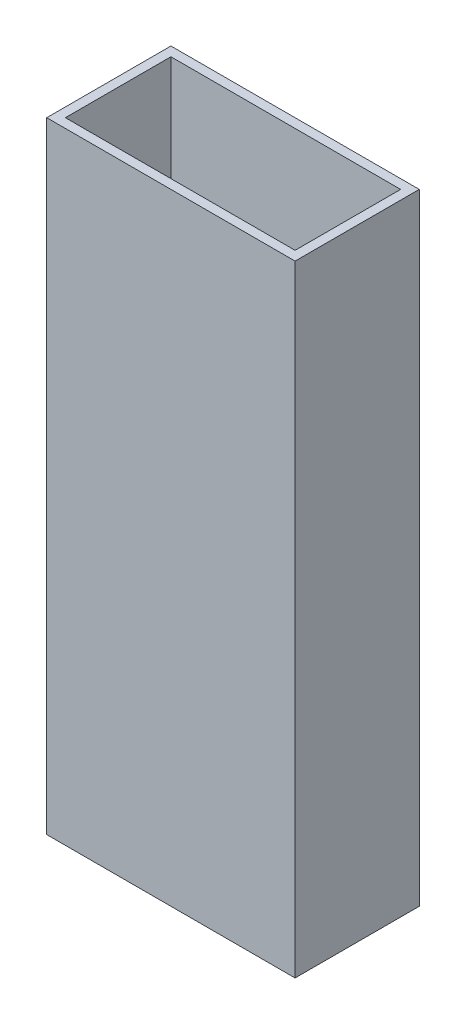
ISO-10303-21;
HEADER;
FILE_DESCRIPTION(('STEP AP214'),'2;1');
FILE_NAME('part.step','',(''),(''),'','','');
FILE_SCHEMA(('AUTOMOTIVE_DESIGN { 1 0 10303 214 1 1 1 1 }'));
ENDSEC;
DATA;
#1=APPLICATION_CONTEXT('core data for automotive mechanical design processes');
#2=APPLICATION_PROTOCOL_DEFINITION('international standard','automotive_design',2000,#1);
#3=PRODUCT_CONTEXT('',#1,'mechanical');
#4=PRODUCT('Part','Part','',(#3));
#5=PRODUCT_RELATED_PRODUCT_CATEGORY('part','',(#4));
#6=PRODUCT_DEFINITION_FORMATION('','',#4);
#7=PRODUCT_DEFINITION_CONTEXT('part definition',#1,'design');
#8=PRODUCT_DEFINITION('design','',#6,#7);
#9=PRODUCT_DEFINITION_SHAPE('','',#8);
#10=(LENGTH_UNIT() NAMED_UNIT(*) SI_UNIT(.MILLI.,.METRE.));
#11=(NAMED_UNIT(*) PLANE_ANGLE_UNIT() SI_UNIT($,.RADIAN.));
#12=(NAMED_UNIT(*) SI_UNIT($,.STERADIAN.) SOLID_ANGLE_UNIT());
#13=UNCERTAINTY_MEASURE_WITH_UNIT(LENGTH_MEASURE(1.E-05),#10,'distance_accuracy_value','');
#14=(GEOMETRIC_REPRESENTATION_CONTEXT(3) GLOBAL_UNCERTAINTY_ASSIGNED_CONTEXT((#13)) GLOBAL_UNIT_ASSIGNED_CONTEXT((#10,
#11,#12)) REPRESENTATION_CONTEXT('',''));
#15=CARTESIAN_POINT('',(0.,0.,0.));
#16=DIRECTION('',(0.,0.,1.));
#17=DIRECTION('',(1.,0.,0.));
#18=AXIS2_PLACEMENT_3D('',#15,#16,#17);
#19=CARTESIAN_POINT('',(0.,100.,0.));
#20=DIRECTION('',(0.,-1.,0.));
#21=DIRECTION('',(0.,0.,-1.));
#22=AXIS2_PLACEMENT_3D('',#19,#20,#21);
#23=PLANE('',#22);
#24=DIRECTION('',(0.,0.,-1.));
#25=VECTOR('',#24,1.);
#26=CARTESIAN_POINT('',(20.,100.,10.));
#27=LINE('',#26,#25);
#28=CARTESIAN_POINT('',(20.,100.,10.));
#29=VERTEX_POINT('',#28);
#30=CARTESIAN_POINT('',(20.,100.,-10.));
#31=VERTEX_POINT('',#30);
#32=EDGE_CURVE('E134',#29,#31,#27,.T.);
#33=ORIENTED_EDGE('',*,*,#32,.T.);
#34=DIRECTION('',(-1.,0.,0.));
#35=VECTOR('',#34,1.);
#36=CARTESIAN_POINT('',(-20.,100.,-10.));
#37=LINE('',#36,#35);
#38=CARTESIAN_POINT('',(-20.,100.,-10.));
#39=VERTEX_POINT('',#38);
#40=EDGE_CURVE('E137',#31,#39,#37,.T.);
#41=ORIENTED_EDGE('',*,*,#40,.T.);
#42=DIRECTION('',(0.,0.,1.));
#43=VECTOR('',#42,1.);
#44=CARTESIAN_POINT('',(-20.,100.,10.));
#45=LINE('',#44,#43);
#46=CARTESIAN_POINT('',(-20.,100.,10.));
#47=VERTEX_POINT('',#46);
#48=EDGE_CURVE('E140',#39,#47,#45,.T.);
#49=ORIENTED_EDGE('',*,*,#48,.T.);
#50=DIRECTION('',(1.,0.,0.));
#51=VECTOR('',#50,1.);
#52=CARTESIAN_POINT('',(-20.,100.,10.));
#53=LINE('',#52,#51);
#54=EDGE_CURVE('E142',#47,#29,#53,.T.);
#55=ORIENTED_EDGE('',*,*,#54,.T.);
#56=EDGE_LOOP('',(#33,#41,#49,#55));
#57=FACE_BOUND('',#56,.T.);
#58=DIRECTION('',(0.,0.,1.));
#59=VECTOR('',#58,1.);
#60=CARTESIAN_POINT('',(-18.5,100.,8.5));
#61=LINE('',#60,#59);
#62=CARTESIAN_POINT('',(-18.5,100.,-8.5));
#63=VERTEX_POINT('',#62);
#64=CARTESIAN_POINT('',(-18.5,100.,8.5));
#65=VERTEX_POINT('',#64);
#66=EDGE_CURVE('E98',#63,#65,#61,.T.);
#67=ORIENTED_EDGE('',*,*,#66,.F.);
#68=DIRECTION('',(-1.,0.,0.));
#69=VECTOR('',#68,1.);
#70=CARTESIAN_POINT('',(18.5,100.,-8.5));
#71=LINE('',#70,#69);
#72=CARTESIAN_POINT('',(18.5,100.,-8.5));
#73=VERTEX_POINT('',#72);
#74=EDGE_CURVE('E120',#73,#63,#71,.T.);
#75=ORIENTED_EDGE('',*,*,#74,.F.);
#76=DIRECTION('',(0.,0.,-1.));
#77=VECTOR('',#76,1.);
#78=CARTESIAN_POINT('',(18.5,100.,8.5));
#79=LINE('',#78,#77);
#80=CARTESIAN_POINT('',(18.5,100.,8.5));
#81=VERTEX_POINT('',#80);
#82=EDGE_CURVE('E118',#81,#73,#79,.T.);
#83=ORIENTED_EDGE('',*,*,#82,.F.);
#84=DIRECTION('',(1.,0.,0.));
#85=VECTOR('',#84,1.);
#86=CARTESIAN_POINT('',(18.5,100.,8.5));
#87=LINE('',#86,#85);
#88=EDGE_CURVE('E106',#65,#81,#87,.T.);
#89=ORIENTED_EDGE('',*,*,#88,.F.);
#90=EDGE_LOOP('',(#67,#75,#83,#89));
#91=FACE_BOUND('',#90,.T.);
#92=ADVANCED_FACE('F33',(#57,#91),#23,.F.);
#93=CARTESIAN_POINT('',(0.,0.,0.));
#94=DIRECTION('',(0.,-1.,0.));
#95=DIRECTION('',(0.,0.,-1.));
#96=AXIS2_PLACEMENT_3D('',#93,#94,#95);
#97=PLANE('',#96);
#98=DIRECTION('',(0.,0.,-1.));
#99=VECTOR('',#98,1.);
#100=CARTESIAN_POINT('',(20.,0.,10.));
#101=LINE('',#100,#99);
#102=CARTESIAN_POINT('',(20.,0.,10.));
#103=VERTEX_POINT('',#102);
#104=CARTESIAN_POINT('',(20.,0.,-10.));
#105=VERTEX_POINT('',#104);
#106=EDGE_CURVE('E114',#103,#105,#101,.T.);
#107=ORIENTED_EDGE('',*,*,#106,.F.);
#108=DIRECTION('',(1.,0.,0.));
#109=VECTOR('',#108,1.);
#110=CARTESIAN_POINT('',(-20.,0.,10.));
#111=LINE('',#110,#109);
#112=CARTESIAN_POINT('',(-20.,0.,10.));
#113=VERTEX_POINT('',#112);
#114=EDGE_CURVE('E138',#113,#103,#111,.T.);
#115=ORIENTED_EDGE('',*,*,#114,.F.);
#116=DIRECTION('',(0.,0.,1.));
#117=VECTOR('',#116,1.);
#118=CARTESIAN_POINT('',(-20.,0.,10.));
#119=LINE('',#118,#117);
#120=CARTESIAN_POINT('',(-20.,0.,-10.));
#121=VERTEX_POINT('',#120);
#122=EDGE_CURVE('E149',#121,#113,#119,.T.);
#123=ORIENTED_EDGE('',*,*,#122,.F.);
#124=DIRECTION('',(-1.,0.,0.));
#125=VECTOR('',#124,1.);
#126=CARTESIAN_POINT('',(-20.,0.,-10.));
#127=LINE('',#126,#125);
#128=EDGE_CURVE('E147',#105,#121,#127,.T.);
#129=ORIENTED_EDGE('',*,*,#128,.F.);
#130=EDGE_LOOP('',(#107,#115,#123,#129));
#131=FACE_BOUND('',#130,.T.);
#132=DIRECTION('',(-1.,0.,0.));
#133=VECTOR('',#132,1.);
#134=CARTESIAN_POINT('',(18.5,0.,-8.5));
#135=LINE('',#134,#133);
#136=CARTESIAN_POINT('',(18.5,0.,-8.5));
#137=VERTEX_POINT('',#136);
#138=CARTESIAN_POINT('',(-18.5,0.,-8.5));
#139=VERTEX_POINT('',#138);
#140=EDGE_CURVE('E107',#137,#139,#135,.T.);
#141=ORIENTED_EDGE('',*,*,#140,.T.);
#142=DIRECTION('',(0.,0.,1.));
#143=VECTOR('',#142,1.);
#144=CARTESIAN_POINT('',(-18.5,0.,8.5));
#145=LINE('',#144,#143);
#146=CARTESIAN_POINT('',(-18.5,0.,8.5));
#147=VERTEX_POINT('',#146);
#148=EDGE_CURVE('E56',#139,#147,#145,.T.);
#149=ORIENTED_EDGE('',*,*,#148,.T.);
#150=DIRECTION('',(1.,0.,0.));
#151=VECTOR('',#150,1.);
#152=CARTESIAN_POINT('',(18.5,0.,8.5));
#153=LINE('',#152,#151);
#154=CARTESIAN_POINT('',(18.5,0.,8.5));
#155=VERTEX_POINT('',#154);
#156=EDGE_CURVE('E113',#147,#155,#153,.T.);
#157=ORIENTED_EDGE('',*,*,#156,.T.);
#158=DIRECTION('',(0.,0.,-1.));
#159=VECTOR('',#158,1.);
#160=CARTESIAN_POINT('',(18.5,0.,8.5));
#161=LINE('',#160,#159);
#162=EDGE_CURVE('E126',#155,#137,#161,.T.);
#163=ORIENTED_EDGE('',*,*,#162,.T.);
#164=EDGE_LOOP('',(#141,#149,#157,#163));
#165=FACE_BOUND('',#164,.T.);
#166=ADVANCED_FACE('F167',(#131,#165),#97,.T.);
#167=CARTESIAN_POINT('',(20.,100.,10.));
#168=DIRECTION('',(-1.,0.,0.));
#169=DIRECTION('',(0.,0.,1.));
#170=AXIS2_PLACEMENT_3D('',#167,#168,#169);
#171=PLANE('',#170);
#172=ORIENTED_EDGE('',*,*,#106,.T.);
#173=DIRECTION('',(0.,-1.,0.));
#174=VECTOR('',#173,1.);
#175=CARTESIAN_POINT('',(20.,100.,-10.));
#176=LINE('',#175,#174);
#177=EDGE_CURVE('E11',#31,#105,#176,.T.);
#178=ORIENTED_EDGE('',*,*,#177,.F.);
#179=ORIENTED_EDGE('',*,*,#32,.F.);
#180=DIRECTION('',(0.,-1.,0.));
#181=VECTOR('',#180,1.);
#182=CARTESIAN_POINT('',(20.,100.,10.));
#183=LINE('',#182,#181);
#184=EDGE_CURVE('E144',#29,#103,#183,.T.);
#185=ORIENTED_EDGE('',*,*,#184,.T.);
#186=EDGE_LOOP('',(#172,#178,#179,#185));
#187=FACE_BOUND('',#186,.T.);
#188=ADVANCED_FACE('F35',(#187),#171,.F.);
#189=CARTESIAN_POINT('',(-20.,100.,-10.));
#190=DIRECTION('',(0.,0.,1.));
#191=DIRECTION('',(1.,0.,0.));
#192=AXIS2_PLACEMENT_3D('',#189,#190,#191);
#193=PLANE('',#192);
#194=ORIENTED_EDGE('',*,*,#128,.T.);
#195=DIRECTION('',(0.,-1.,0.));
#196=VECTOR('',#195,1.);
#197=CARTESIAN_POINT('',(-20.,100.,-10.));
#198=LINE('',#197,#196);
#199=EDGE_CURVE('E41',#39,#121,#198,.T.);
#200=ORIENTED_EDGE('',*,*,#199,.F.);
#201=ORIENTED_EDGE('',*,*,#40,.F.);
#202=ORIENTED_EDGE('',*,*,#177,.T.);
#203=EDGE_LOOP('',(#194,#200,#201,#202));
#204=FACE_BOUND('',#203,.T.);
#205=ADVANCED_FACE('F177',(#204),#193,.F.);
#206=CARTESIAN_POINT('',(-20.,100.,10.));
#207=DIRECTION('',(1.,0.,0.));
#208=DIRECTION('',(0.,0.,-1.));
#209=AXIS2_PLACEMENT_3D('',#206,#207,#208);
#210=PLANE('',#209);
#211=ORIENTED_EDGE('',*,*,#122,.T.);
#212=DIRECTION('',(0.,-1.,0.));
#213=VECTOR('',#212,1.);
#214=CARTESIAN_POINT('',(-20.,100.,10.));
#215=LINE('',#214,#213);
#216=EDGE_CURVE('E154',#47,#113,#215,.T.);
#217=ORIENTED_EDGE('',*,*,#216,.F.);
#218=ORIENTED_EDGE('',*,*,#48,.F.);
#219=ORIENTED_EDGE('',*,*,#199,.T.);
#220=EDGE_LOOP('',(#211,#217,#218,#219));
#221=FACE_BOUND('',#220,.T.);
#222=ADVANCED_FACE('F161',(#221),#210,.F.);
#223=CARTESIAN_POINT('',(-20.,100.,10.));
#224=DIRECTION('',(0.,0.,-1.));
#225=DIRECTION('',(-1.,0.,0.));
#226=AXIS2_PLACEMENT_3D('',#223,#224,#225);
#227=PLANE('',#226);
#228=ORIENTED_EDGE('',*,*,#114,.T.);
#229=ORIENTED_EDGE('',*,*,#184,.F.);
#230=ORIENTED_EDGE('',*,*,#54,.F.);
#231=ORIENTED_EDGE('',*,*,#216,.T.);
#232=EDGE_LOOP('',(#228,#229,#230,#231));
#233=FACE_BOUND('',#232,.T.);
#234=ADVANCED_FACE('F171',(#233),#227,.F.);
#235=CARTESIAN_POINT('',(-18.5,100.,8.5));
#236=DIRECTION('',(1.,0.,0.));
#237=DIRECTION('',(0.,0.,-1.));
#238=AXIS2_PLACEMENT_3D('',#235,#236,#237);
#239=PLANE('',#238);
#240=ORIENTED_EDGE('',*,*,#148,.F.);
#241=DIRECTION('',(0.,-1.,0.));
#242=VECTOR('',#241,1.);
#243=CARTESIAN_POINT('',(-18.5,100.,-8.5));
#244=LINE('',#243,#242);
#245=EDGE_CURVE('E102',#63,#139,#244,.T.);
#246=ORIENTED_EDGE('',*,*,#245,.F.);
#247=ORIENTED_EDGE('',*,*,#66,.T.);
#248=DIRECTION('',(0.,-1.,0.));
#249=VECTOR('',#248,1.);
#250=CARTESIAN_POINT('',(-18.5,100.,8.5));
#251=LINE('',#250,#249);
#252=EDGE_CURVE('E101',#65,#147,#251,.T.);
#253=ORIENTED_EDGE('',*,*,#252,.T.);
#254=EDGE_LOOP('',(#240,#246,#247,#253));
#255=FACE_BOUND('',#254,.T.);
#256=ADVANCED_FACE('F100',(#255),#239,.T.);
#257=CARTESIAN_POINT('',(18.5,100.,8.5));
#258=DIRECTION('',(0.,0.,-1.));
#259=DIRECTION('',(-1.,0.,0.));
#260=AXIS2_PLACEMENT_3D('',#257,#258,#259);
#261=PLANE('',#260);
#262=ORIENTED_EDGE('',*,*,#156,.F.);
#263=ORIENTED_EDGE('',*,*,#252,.F.);
#264=ORIENTED_EDGE('',*,*,#88,.T.);
#265=DIRECTION('',(0.,-1.,0.));
#266=VECTOR('',#265,1.);
#267=CARTESIAN_POINT('',(18.5,100.,8.5));
#268=LINE('',#267,#266);
#269=EDGE_CURVE('E115',#81,#155,#268,.T.);
#270=ORIENTED_EDGE('',*,*,#269,.T.);
#271=EDGE_LOOP('',(#262,#263,#264,#270));
#272=FACE_BOUND('',#271,.T.);
#273=ADVANCED_FACE('F110',(#272),#261,.T.);
#274=CARTESIAN_POINT('',(18.5,100.,8.5));
#275=DIRECTION('',(-1.,0.,0.));
#276=DIRECTION('',(0.,0.,1.));
#277=AXIS2_PLACEMENT_3D('',#274,#275,#276);
#278=PLANE('',#277);
#279=ORIENTED_EDGE('',*,*,#162,.F.);
#280=ORIENTED_EDGE('',*,*,#269,.F.);
#281=ORIENTED_EDGE('',*,*,#82,.T.);
#282=DIRECTION('',(0.,-1.,0.));
#283=VECTOR('',#282,1.);
#284=CARTESIAN_POINT('',(18.5,100.,-8.5));
#285=LINE('',#284,#283);
#286=EDGE_CURVE('E48',#73,#137,#285,.T.);
#287=ORIENTED_EDGE('',*,*,#286,.T.);
#288=EDGE_LOOP('',(#279,#280,#281,#287));
#289=FACE_BOUND('',#288,.T.);
#290=ADVANCED_FACE('F200',(#289),#278,.T.);
#291=CARTESIAN_POINT('',(18.5,100.,-8.5));
#292=DIRECTION('',(0.,0.,1.));
#293=DIRECTION('',(1.,0.,0.));
#294=AXIS2_PLACEMENT_3D('',#291,#292,#293);
#295=PLANE('',#294);
#296=ORIENTED_EDGE('',*,*,#140,.F.);
#297=ORIENTED_EDGE('',*,*,#286,.F.);
#298=ORIENTED_EDGE('',*,*,#74,.T.);
#299=ORIENTED_EDGE('',*,*,#245,.T.);
#300=EDGE_LOOP('',(#296,#297,#298,#299));
#301=FACE_BOUND('',#300,.T.);
#302=ADVANCED_FACE('F204',(#301),#295,.T.);
#303=CLOSED_SHELL('',(#92,#166,#188,#205,#222,#234,#256,#273,#290,#302));
#304=MANIFOLD_SOLID_BREP('B2',#303);
#305=ADVANCED_BREP_SHAPE_REPRESENTATION('',(#18,#304),#14);
#306=SHAPE_DEFINITION_REPRESENTATION(#9,#305);
ENDSEC;
END-ISO-10303-21;
